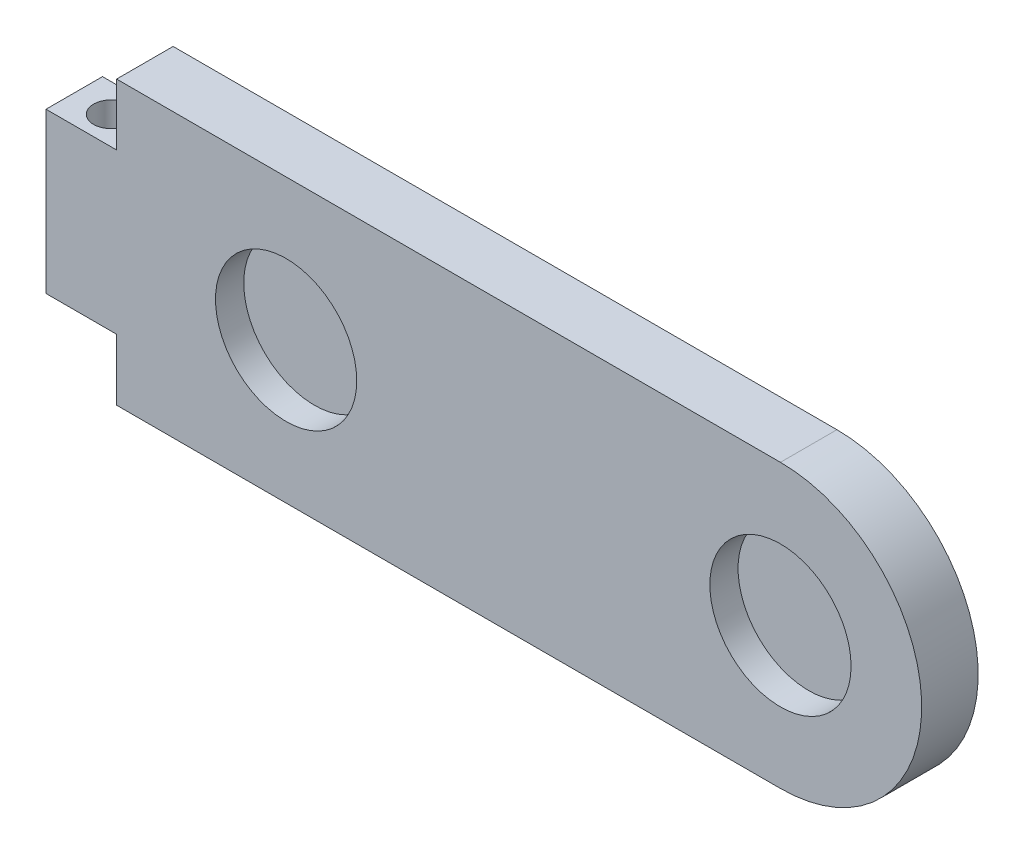
ISO-10303-21;
HEADER;
FILE_DESCRIPTION(('STEP AP214'),'2;1');
FILE_NAME('part.step','',(''),(''),'','','');
FILE_SCHEMA(('AUTOMOTIVE_DESIGN { 1 0 10303 214 1 1 1 1 }'));
ENDSEC;
DATA;
#1=APPLICATION_CONTEXT('core data for automotive mechanical design processes');
#2=APPLICATION_PROTOCOL_DEFINITION('international standard','automotive_design',2000,#1);
#3=PRODUCT_CONTEXT('',#1,'mechanical');
#4=PRODUCT('Part','Part','',(#3));
#5=PRODUCT_RELATED_PRODUCT_CATEGORY('part','',(#4));
#6=PRODUCT_DEFINITION_FORMATION('','',#4);
#7=PRODUCT_DEFINITION_CONTEXT('part definition',#1,'design');
#8=PRODUCT_DEFINITION('design','',#6,#7);
#9=PRODUCT_DEFINITION_SHAPE('','',#8);
#10=(LENGTH_UNIT() NAMED_UNIT(*) SI_UNIT(.MILLI.,.METRE.));
#11=(NAMED_UNIT(*) PLANE_ANGLE_UNIT() SI_UNIT($,.RADIAN.));
#12=(NAMED_UNIT(*) SI_UNIT($,.STERADIAN.) SOLID_ANGLE_UNIT());
#13=UNCERTAINTY_MEASURE_WITH_UNIT(LENGTH_MEASURE(1.E-05),#10,'distance_accuracy_value','');
#14=(GEOMETRIC_REPRESENTATION_CONTEXT(3) GLOBAL_UNCERTAINTY_ASSIGNED_CONTEXT((#13)) GLOBAL_UNIT_ASSIGNED_CONTEXT((#10,
#11,#12)) REPRESENTATION_CONTEXT('',''));
#15=CARTESIAN_POINT('',(0.,0.,0.));
#16=DIRECTION('',(0.,0.,1.));
#17=DIRECTION('',(1.,0.,0.));
#18=AXIS2_PLACEMENT_3D('',#15,#16,#17);
#19=CARTESIAN_POINT('',(0.,-10.,4.));
#20=DIRECTION('',(0.,1.,0.));
#21=DIRECTION('',(0.,0.,1.));
#22=AXIS2_PLACEMENT_3D('',#19,#20,#21);
#23=PLANE('',#22);
#24=DIRECTION('',(1.,0.,0.));
#25=VECTOR('',#24,1.);
#26=CARTESIAN_POINT('',(-10.,-10.,4.));
#27=LINE('',#26,#25);
#28=CARTESIAN_POINT('',(-10.,-10.,4.));
#29=VERTEX_POINT('',#28);
#30=CARTESIAN_POINT('',(37.,-10.,4.));
#31=VERTEX_POINT('',#30);
#32=EDGE_CURVE('E140',#29,#31,#27,.T.);
#33=ORIENTED_EDGE('',*,*,#32,.F.);
#34=DIRECTION('',(0.,0.,1.));
#35=VECTOR('',#34,1.);
#36=CARTESIAN_POINT('',(-10.,-10.,-6.62740522376594));
#37=LINE('',#36,#35);
#38=CARTESIAN_POINT('',(-10.,-10.,0.));
#39=VERTEX_POINT('',#38);
#40=EDGE_CURVE('E194',#39,#29,#37,.T.);
#41=ORIENTED_EDGE('',*,*,#40,.F.);
#42=DIRECTION('',(1.,0.,0.));
#43=VECTOR('',#42,1.);
#44=CARTESIAN_POINT('',(0.,-10.,0.));
#45=LINE('',#44,#43);
#46=CARTESIAN_POINT('',(37.,-10.,0.));
#47=VERTEX_POINT('',#46);
#48=EDGE_CURVE('E127',#39,#47,#45,.T.);
#49=ORIENTED_EDGE('',*,*,#48,.T.);
#50=DIRECTION('',(0.,0.,-1.));
#51=VECTOR('',#50,1.);
#52=CARTESIAN_POINT('',(37.,-10.,4.));
#53=LINE('',#52,#51);
#54=EDGE_CURVE('E11',#31,#47,#53,.T.);
#55=ORIENTED_EDGE('',*,*,#54,.F.);
#56=EDGE_LOOP('',(#33,#41,#49,#55));
#57=FACE_BOUND('',#56,.T.);
#58=ADVANCED_FACE('F39',(#57),#23,.F.);
#59=CARTESIAN_POINT('',(37.,0.,4.));
#60=DIRECTION('',(0.,0.,-1.));
#61=DIRECTION('',(-1.,0.,0.));
#62=AXIS2_PLACEMENT_3D('',#59,#60,#61);
#63=CYLINDRICAL_SURFACE('',#62,10.);
#64=CARTESIAN_POINT('',(37.,0.,0.));
#65=DIRECTION('',(0.,0.,1.));
#66=DIRECTION('',(1.,0.,0.));
#67=AXIS2_PLACEMENT_3D('',#64,#65,#66);
#68=CIRCLE('',#67,10.);
#69=CARTESIAN_POINT('',(37.,10.,0.));
#70=VERTEX_POINT('',#69);
#71=EDGE_CURVE('E132',#47,#70,#68,.T.);
#72=ORIENTED_EDGE('',*,*,#71,.T.);
#73=DIRECTION('',(0.,0.,-1.));
#74=VECTOR('',#73,1.);
#75=CARTESIAN_POINT('',(37.,10.,4.));
#76=LINE('',#75,#74);
#77=CARTESIAN_POINT('',(37.,10.,4.));
#78=VERTEX_POINT('',#77);
#79=EDGE_CURVE('E47',#78,#70,#76,.T.);
#80=ORIENTED_EDGE('',*,*,#79,.F.);
#81=CARTESIAN_POINT('',(37.,0.,4.));
#82=DIRECTION('',(0.,0.,1.));
#83=DIRECTION('',(1.,0.,0.));
#84=AXIS2_PLACEMENT_3D('',#81,#82,#83);
#85=CIRCLE('',#84,10.);
#86=EDGE_CURVE('E144',#31,#78,#85,.T.);
#87=ORIENTED_EDGE('',*,*,#86,.F.);
#88=ORIENTED_EDGE('',*,*,#54,.T.);
#89=EDGE_LOOP('',(#72,#80,#87,#88));
#90=FACE_BOUND('',#89,.T.);
#91=ADVANCED_FACE('F209',(#90),#63,.T.);
#92=CARTESIAN_POINT('',(0.,10.,4.));
#93=DIRECTION('',(0.,-1.,0.));
#94=DIRECTION('',(0.,0.,-1.));
#95=AXIS2_PLACEMENT_3D('',#92,#93,#94);
#96=PLANE('',#95);
#97=DIRECTION('',(-1.,0.,0.));
#98=VECTOR('',#97,1.);
#99=CARTESIAN_POINT('',(0.,10.,0.));
#100=LINE('',#99,#98);
#101=CARTESIAN_POINT('',(-10.,10.,0.));
#102=VERTEX_POINT('',#101);
#103=EDGE_CURVE('E141',#70,#102,#100,.T.);
#104=ORIENTED_EDGE('',*,*,#103,.T.);
#105=DIRECTION('',(0.,0.,1.));
#106=VECTOR('',#105,1.);
#107=CARTESIAN_POINT('',(-10.,10.,-6.62740522376594));
#108=LINE('',#107,#106);
#109=CARTESIAN_POINT('',(-10.,10.,4.));
#110=VERTEX_POINT('',#109);
#111=EDGE_CURVE('E169',#102,#110,#108,.T.);
#112=ORIENTED_EDGE('',*,*,#111,.T.);
#113=DIRECTION('',(-1.,0.,0.));
#114=VECTOR('',#113,1.);
#115=CARTESIAN_POINT('',(0.,10.,4.));
#116=LINE('',#115,#114);
#117=EDGE_CURVE('E137',#78,#110,#116,.T.);
#118=ORIENTED_EDGE('',*,*,#117,.F.);
#119=ORIENTED_EDGE('',*,*,#79,.T.);
#120=EDGE_LOOP('',(#104,#112,#118,#119));
#121=FACE_BOUND('',#120,.T.);
#122=ADVANCED_FACE('F157',(#121),#96,.F.);
#123=CARTESIAN_POINT('',(37.,0.,4.));
#124=DIRECTION('',(0.,0.,1.));
#125=DIRECTION('',(1.,0.,0.));
#126=AXIS2_PLACEMENT_3D('',#123,#124,#125);
#127=PLANE('',#126);
#128=CARTESIAN_POINT('',(37.,0.,4.));
#129=DIRECTION('',(0.,0.,1.));
#130=DIRECTION('',(1.,0.,0.));
#131=AXIS2_PLACEMENT_3D('',#128,#129,#130);
#132=CIRCLE('',#131,5.);
#133=CARTESIAN_POINT('',(42.,0.,4.));
#134=VERTEX_POINT('',#133);
#135=EDGE_CURVE('E262',#134,#134,#132,.T.);
#136=ORIENTED_EDGE('',*,*,#135,.F.);
#137=EDGE_LOOP('',(#136));
#138=FACE_BOUND('',#137,.T.);
#139=CARTESIAN_POINT('',(1.99999999999999,0.,4.));
#140=DIRECTION('',(0.,0.,1.));
#141=DIRECTION('',(1.,0.,0.));
#142=AXIS2_PLACEMENT_3D('',#139,#140,#141);
#143=CIRCLE('',#142,5.);
#144=CARTESIAN_POINT('',(6.99999999999999,0.,4.));
#145=VERTEX_POINT('',#144);
#146=EDGE_CURVE('E274',#145,#145,#143,.T.);
#147=ORIENTED_EDGE('',*,*,#146,.F.);
#148=EDGE_LOOP('',(#147));
#149=FACE_BOUND('',#148,.T.);
#150=DIRECTION('',(0.,1.,0.));
#151=VECTOR('',#150,1.);
#152=CARTESIAN_POINT('',(-10.,10.,4.));
#153=LINE('',#152,#151);
#154=CARTESIAN_POINT('',(-10.,5.65,4.));
#155=VERTEX_POINT('',#154);
#156=EDGE_CURVE('E114',#155,#110,#153,.T.);
#157=ORIENTED_EDGE('',*,*,#156,.F.);
#158=DIRECTION('',(1.,0.,0.));
#159=VECTOR('',#158,1.);
#160=CARTESIAN_POINT('',(-15.,5.65,4.));
#161=LINE('',#160,#159);
#162=CARTESIAN_POINT('',(-15.,5.65,4.));
#163=VERTEX_POINT('',#162);
#164=EDGE_CURVE('E106',#163,#155,#161,.T.);
#165=ORIENTED_EDGE('',*,*,#164,.F.);
#166=DIRECTION('',(0.,1.,0.));
#167=VECTOR('',#166,1.);
#168=CARTESIAN_POINT('',(-15.,10.,4.));
#169=LINE('',#168,#167);
#170=CARTESIAN_POINT('',(-15.,-5.65,4.));
#171=VERTEX_POINT('',#170);
#172=EDGE_CURVE('E119',#171,#163,#169,.T.);
#173=ORIENTED_EDGE('',*,*,#172,.F.);
#174=DIRECTION('',(-1.,0.,0.));
#175=VECTOR('',#174,1.);
#176=CARTESIAN_POINT('',(-15.,-5.65,4.));
#177=LINE('',#176,#175);
#178=CARTESIAN_POINT('',(-10.,-5.65,4.));
#179=VERTEX_POINT('',#178);
#180=EDGE_CURVE('E54',#179,#171,#177,.T.);
#181=ORIENTED_EDGE('',*,*,#180,.F.);
#182=DIRECTION('',(0.,1.,0.));
#183=VECTOR('',#182,1.);
#184=CARTESIAN_POINT('',(-10.,-10.,4.));
#185=LINE('',#184,#183);
#186=EDGE_CURVE('E188',#29,#179,#185,.T.);
#187=ORIENTED_EDGE('',*,*,#186,.F.);
#188=ORIENTED_EDGE('',*,*,#32,.T.);
#189=ORIENTED_EDGE('',*,*,#86,.T.);
#190=ORIENTED_EDGE('',*,*,#117,.T.);
#191=EDGE_LOOP('',(#157,#165,#173,#181,#187,#188,#189,#190));
#192=FACE_BOUND('',#191,.T.);
#193=ADVANCED_FACE('F118',(#138,#149,#192),#127,.T.);
#194=CARTESIAN_POINT('',(37.,0.,0.));
#195=DIRECTION('',(0.,0.,1.));
#196=DIRECTION('',(1.,0.,0.));
#197=AXIS2_PLACEMENT_3D('',#194,#195,#196);
#198=PLANE('',#197);
#199=DIRECTION('',(-1.,0.,0.));
#200=VECTOR('',#199,1.);
#201=CARTESIAN_POINT('',(-15.,5.65,0.));
#202=LINE('',#201,#200);
#203=CARTESIAN_POINT('',(-10.,5.65,0.));
#204=VERTEX_POINT('',#203);
#205=CARTESIAN_POINT('',(-15.,5.65,0.));
#206=VERTEX_POINT('',#205);
#207=EDGE_CURVE('E62',#204,#206,#202,.T.);
#208=ORIENTED_EDGE('',*,*,#207,.F.);
#209=DIRECTION('',(0.,-1.,0.));
#210=VECTOR('',#209,1.);
#211=CARTESIAN_POINT('',(-10.,10.,0.));
#212=LINE('',#211,#210);
#213=EDGE_CURVE('E166',#102,#204,#212,.T.);
#214=ORIENTED_EDGE('',*,*,#213,.F.);
#215=ORIENTED_EDGE('',*,*,#103,.F.);
#216=ORIENTED_EDGE('',*,*,#71,.F.);
#217=ORIENTED_EDGE('',*,*,#48,.F.);
#218=DIRECTION('',(0.,-1.,0.));
#219=VECTOR('',#218,1.);
#220=CARTESIAN_POINT('',(-10.,-10.,0.));
#221=LINE('',#220,#219);
#222=CARTESIAN_POINT('',(-10.,-5.65,0.));
#223=VERTEX_POINT('',#222);
#224=EDGE_CURVE('E183',#223,#39,#221,.T.);
#225=ORIENTED_EDGE('',*,*,#224,.F.);
#226=DIRECTION('',(1.,0.,0.));
#227=VECTOR('',#226,1.);
#228=CARTESIAN_POINT('',(-15.,-5.65,0.));
#229=LINE('',#228,#227);
#230=CARTESIAN_POINT('',(-15.,-5.65,0.));
#231=VERTEX_POINT('',#230);
#232=EDGE_CURVE('E122',#231,#223,#229,.T.);
#233=ORIENTED_EDGE('',*,*,#232,.F.);
#234=DIRECTION('',(0.,-1.,0.));
#235=VECTOR('',#234,1.);
#236=CARTESIAN_POINT('',(-15.,10.,0.));
#237=LINE('',#236,#235);
#238=EDGE_CURVE('E128',#206,#231,#237,.T.);
#239=ORIENTED_EDGE('',*,*,#238,.F.);
#240=EDGE_LOOP('',(#208,#214,#215,#216,#217,#225,#233,#239));
#241=FACE_BOUND('',#240,.T.);
#242=ADVANCED_FACE('F164',(#241),#198,.F.);
#243=CARTESIAN_POINT('',(-15.,0.,0.));
#244=DIRECTION('',(-1.,0.,0.));
#245=DIRECTION('',(0.,0.,1.));
#246=AXIS2_PLACEMENT_3D('',#243,#244,#245);
#247=PLANE('',#246);
#248=DIRECTION('',(0.,0.,1.));
#249=VECTOR('',#248,1.);
#250=CARTESIAN_POINT('',(-15.,5.65,-6.62740522376594));
#251=LINE('',#250,#249);
#252=EDGE_CURVE('E103',#206,#163,#251,.T.);
#253=ORIENTED_EDGE('',*,*,#252,.F.);
#254=ORIENTED_EDGE('',*,*,#238,.T.);
#255=DIRECTION('',(0.,0.,1.));
#256=VECTOR('',#255,1.);
#257=CARTESIAN_POINT('',(-15.,-5.65,-6.62740522376594));
#258=LINE('',#257,#256);
#259=EDGE_CURVE('E125',#231,#171,#258,.T.);
#260=ORIENTED_EDGE('',*,*,#259,.T.);
#261=ORIENTED_EDGE('',*,*,#172,.T.);
#262=EDGE_LOOP('',(#253,#254,#260,#261));
#263=FACE_BOUND('',#262,.T.);
#264=ADVANCED_FACE('F124',(#263),#247,.T.);
#265=CARTESIAN_POINT('',(-15.,-5.65,-6.62740522376594));
#266=DIRECTION('',(0.,1.,0.));
#267=DIRECTION('',(0.,0.,1.));
#268=AXIS2_PLACEMENT_3D('',#265,#266,#267);
#269=PLANE('',#268);
#270=CARTESIAN_POINT('',(-12.3796590009757,-5.65,2.));
#271=DIRECTION('',(0.,1.,0.));
#272=DIRECTION('',(0.,0.,1.));
#273=AXIS2_PLACEMENT_3D('',#270,#271,#272);
#274=CIRCLE('',#273,1.25);
#275=CARTESIAN_POINT('',(-12.3796590009757,-5.65,3.25));
#276=VERTEX_POINT('',#275);
#277=EDGE_CURVE('E176',#276,#276,#274,.F.);
#278=ORIENTED_EDGE('',*,*,#277,.F.);
#279=EDGE_LOOP('',(#278));
#280=FACE_BOUND('',#279,.T.);
#281=ORIENTED_EDGE('',*,*,#232,.T.);
#282=DIRECTION('',(0.,0.,1.));
#283=VECTOR('',#282,1.);
#284=CARTESIAN_POINT('',(-10.,-5.65,-6.62740522376594));
#285=LINE('',#284,#283);
#286=EDGE_CURVE('E197',#223,#179,#285,.T.);
#287=ORIENTED_EDGE('',*,*,#286,.T.);
#288=ORIENTED_EDGE('',*,*,#180,.T.);
#289=ORIENTED_EDGE('',*,*,#259,.F.);
#290=EDGE_LOOP('',(#281,#287,#288,#289));
#291=FACE_BOUND('',#290,.T.);
#292=ADVANCED_FACE('F224',(#280,#291),#269,.F.);
#293=CARTESIAN_POINT('',(-10.,-10.,-6.62740522376594));
#294=DIRECTION('',(1.,0.,0.));
#295=DIRECTION('',(0.,0.,-1.));
#296=AXIS2_PLACEMENT_3D('',#293,#294,#295);
#297=PLANE('',#296);
#298=ORIENTED_EDGE('',*,*,#224,.T.);
#299=ORIENTED_EDGE('',*,*,#40,.T.);
#300=ORIENTED_EDGE('',*,*,#186,.T.);
#301=ORIENTED_EDGE('',*,*,#286,.F.);
#302=EDGE_LOOP('',(#298,#299,#300,#301));
#303=FACE_BOUND('',#302,.T.);
#304=ADVANCED_FACE('F203',(#303),#297,.F.);
#305=CARTESIAN_POINT('',(-10.,10.,-6.62740522376594));
#306=DIRECTION('',(1.,0.,0.));
#307=DIRECTION('',(0.,0.,-1.));
#308=AXIS2_PLACEMENT_3D('',#305,#306,#307);
#309=PLANE('',#308);
#310=ORIENTED_EDGE('',*,*,#213,.T.);
#311=DIRECTION('',(0.,0.,1.));
#312=VECTOR('',#311,1.);
#313=CARTESIAN_POINT('',(-10.,5.65,-6.62740522376594));
#314=LINE('',#313,#312);
#315=EDGE_CURVE('E113',#204,#155,#314,.T.);
#316=ORIENTED_EDGE('',*,*,#315,.T.);
#317=ORIENTED_EDGE('',*,*,#156,.T.);
#318=ORIENTED_EDGE('',*,*,#111,.F.);
#319=EDGE_LOOP('',(#310,#316,#317,#318));
#320=FACE_BOUND('',#319,.T.);
#321=ADVANCED_FACE('F227',(#320),#309,.F.);
#322=CARTESIAN_POINT('',(-15.,5.65,-6.62740522376594));
#323=DIRECTION('',(0.,-1.,0.));
#324=DIRECTION('',(0.,0.,-1.));
#325=AXIS2_PLACEMENT_3D('',#322,#323,#324);
#326=PLANE('',#325);
#327=CARTESIAN_POINT('',(-12.3796590009757,5.65,2.));
#328=DIRECTION('',(0.,1.,0.));
#329=DIRECTION('',(0.,0.,1.));
#330=AXIS2_PLACEMENT_3D('',#327,#328,#329);
#331=CIRCLE('',#330,1.25);
#332=CARTESIAN_POINT('',(-12.3796590009757,5.65,3.25));
#333=VERTEX_POINT('',#332);
#334=EDGE_CURVE('E261',#333,#333,#331,.T.);
#335=ORIENTED_EDGE('',*,*,#334,.F.);
#336=EDGE_LOOP('',(#335));
#337=FACE_BOUND('',#336,.T.);
#338=ORIENTED_EDGE('',*,*,#207,.T.);
#339=ORIENTED_EDGE('',*,*,#252,.T.);
#340=ORIENTED_EDGE('',*,*,#164,.T.);
#341=ORIENTED_EDGE('',*,*,#315,.F.);
#342=EDGE_LOOP('',(#338,#339,#340,#341));
#343=FACE_BOUND('',#342,.T.);
#344=ADVANCED_FACE('F105',(#337,#343),#326,.F.);
#345=CARTESIAN_POINT('',(-12.3796590009757,-9.18553390593274,2.));
#346=DIRECTION('',(0.,1.,0.));
#347=DIRECTION('',(0.,0.,1.));
#348=AXIS2_PLACEMENT_3D('',#345,#346,#347);
#349=CYLINDRICAL_SURFACE('',#348,1.25);
#350=ORIENTED_EDGE('',*,*,#277,.T.);
#351=EDGE_LOOP('',(#350));
#352=FACE_BOUND('',#351,.T.);
#353=ORIENTED_EDGE('',*,*,#334,.T.);
#354=EDGE_LOOP('',(#353));
#355=FACE_BOUND('',#354,.T.);
#356=ADVANCED_FACE('F233',(#352,#355),#349,.F.);
#357=CARTESIAN_POINT('',(1.99999999999999,0.,2.));
#358=DIRECTION('',(0.,0.,1.));
#359=DIRECTION('',(1.,0.,0.));
#360=AXIS2_PLACEMENT_3D('',#357,#358,#359);
#361=CYLINDRICAL_SURFACE('',#360,5.);
#362=CARTESIAN_POINT('',(1.99999999999999,0.,2.));
#363=DIRECTION('',(0.,0.,1.));
#364=DIRECTION('',(1.,0.,0.));
#365=AXIS2_PLACEMENT_3D('',#362,#363,#364);
#366=CIRCLE('',#365,5.);
#367=CARTESIAN_POINT('',(6.99999999999999,0.,2.));
#368=VERTEX_POINT('',#367);
#369=EDGE_CURVE('E268',#368,#368,#366,.T.);
#370=ORIENTED_EDGE('',*,*,#369,.F.);
#371=EDGE_LOOP('',(#370));
#372=FACE_BOUND('',#371,.T.);
#373=ORIENTED_EDGE('',*,*,#146,.T.);
#374=EDGE_LOOP('',(#373));
#375=FACE_BOUND('',#374,.T.);
#376=ADVANCED_FACE('F239',(#372,#375),#361,.F.);
#377=CARTESIAN_POINT('',(1.99999999999999,0.,2.));
#378=DIRECTION('',(0.,0.,1.));
#379=DIRECTION('',(1.,0.,0.));
#380=AXIS2_PLACEMENT_3D('',#377,#378,#379);
#381=PLANE('',#380);
#382=ORIENTED_EDGE('',*,*,#369,.T.);
#383=EDGE_LOOP('',(#382));
#384=FACE_BOUND('',#383,.T.);
#385=ADVANCED_FACE('F243',(#384),#381,.T.);
#386=CARTESIAN_POINT('',(37.,0.,2.));
#387=DIRECTION('',(0.,0.,1.));
#388=DIRECTION('',(1.,0.,0.));
#389=AXIS2_PLACEMENT_3D('',#386,#387,#388);
#390=CYLINDRICAL_SURFACE('',#389,5.);
#391=CARTESIAN_POINT('',(37.,0.,2.));
#392=DIRECTION('',(0.,0.,1.));
#393=DIRECTION('',(1.,0.,0.));
#394=AXIS2_PLACEMENT_3D('',#391,#392,#393);
#395=CIRCLE('',#394,5.);
#396=CARTESIAN_POINT('',(42.,0.,2.));
#397=VERTEX_POINT('',#396);
#398=EDGE_CURVE('E259',#397,#397,#395,.T.);
#399=ORIENTED_EDGE('',*,*,#398,.F.);
#400=EDGE_LOOP('',(#399));
#401=FACE_BOUND('',#400,.T.);
#402=ORIENTED_EDGE('',*,*,#135,.T.);
#403=EDGE_LOOP('',(#402));
#404=FACE_BOUND('',#403,.T.);
#405=ADVANCED_FACE('F247',(#401,#404),#390,.F.);
#406=CARTESIAN_POINT('',(37.,0.,2.));
#407=DIRECTION('',(0.,0.,1.));
#408=DIRECTION('',(1.,0.,0.));
#409=AXIS2_PLACEMENT_3D('',#406,#407,#408);
#410=PLANE('',#409);
#411=ORIENTED_EDGE('',*,*,#398,.T.);
#412=EDGE_LOOP('',(#411));
#413=FACE_BOUND('',#412,.T.);
#414=ADVANCED_FACE('F251',(#413),#410,.T.);
#415=CLOSED_SHELL('',(#58,#91,#122,#193,#242,#264,#292,#304,#321,#344,#356,#376,#385,#405,#414));
#416=MANIFOLD_SOLID_BREP('B2',#415);
#417=ADVANCED_BREP_SHAPE_REPRESENTATION('',(#18,#416),#14);
#418=SHAPE_DEFINITION_REPRESENTATION(#9,#417);
ENDSEC;
END-ISO-10303-21;
